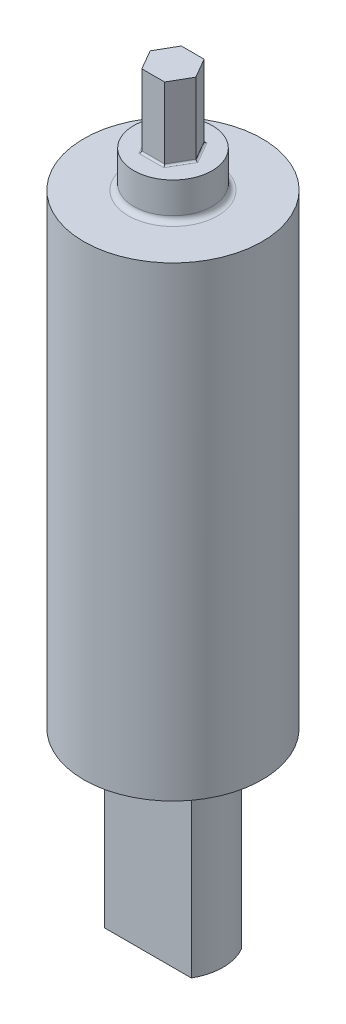
ISO-10303-21;
HEADER;
FILE_DESCRIPTION(('STEP AP214'),'2;1');
FILE_NAME('part.step','',(''),(''),'','','');
FILE_SCHEMA(('AUTOMOTIVE_DESIGN { 1 0 10303 214 1 1 1 1 }'));
ENDSEC;
DATA;
#1=APPLICATION_CONTEXT('core data for automotive mechanical design processes');
#2=APPLICATION_PROTOCOL_DEFINITION('international standard','automotive_design',2000,#1);
#3=PRODUCT_CONTEXT('',#1,'mechanical');
#4=PRODUCT('Part','Part','',(#3));
#5=PRODUCT_RELATED_PRODUCT_CATEGORY('part','',(#4));
#6=PRODUCT_DEFINITION_FORMATION('','',#4);
#7=PRODUCT_DEFINITION_CONTEXT('part definition',#1,'design');
#8=PRODUCT_DEFINITION('design','',#6,#7);
#9=PRODUCT_DEFINITION_SHAPE('','',#8);
#10=(LENGTH_UNIT() NAMED_UNIT(*) SI_UNIT(.MILLI.,.METRE.));
#11=(NAMED_UNIT(*) PLANE_ANGLE_UNIT() SI_UNIT($,.RADIAN.));
#12=(NAMED_UNIT(*) SI_UNIT($,.STERADIAN.) SOLID_ANGLE_UNIT());
#13=UNCERTAINTY_MEASURE_WITH_UNIT(LENGTH_MEASURE(1.E-05),#10,'distance_accuracy_value','');
#14=(GEOMETRIC_REPRESENTATION_CONTEXT(3) GLOBAL_UNCERTAINTY_ASSIGNED_CONTEXT((#13)) GLOBAL_UNIT_ASSIGNED_CONTEXT((#10,
#11,#12)) REPRESENTATION_CONTEXT('',''));
#15=CARTESIAN_POINT('',(0.,0.,0.));
#16=DIRECTION('',(0.,0.,1.));
#17=DIRECTION('',(1.,0.,0.));
#18=AXIS2_PLACEMENT_3D('',#15,#16,#17);
#19=CARTESIAN_POINT('',(0.,-35.6,0.));
#20=DIRECTION('',(0.,1.,0.));
#21=DIRECTION('',(0.,0.,1.));
#22=AXIS2_PLACEMENT_3D('',#19,#20,#21);
#23=CYLINDRICAL_SURFACE('',#22,4.9);
#24=CARTESIAN_POINT('',(0.,0.,0.));
#25=DIRECTION('',(0.,1.,0.));
#26=DIRECTION('',(0.,0.,1.));
#27=AXIS2_PLACEMENT_3D('',#24,#25,#26);
#28=CIRCLE('',#27,4.9);
#29=CARTESIAN_POINT('',(0.,0.,4.9));
#30=VERTEX_POINT('',#29);
#31=EDGE_CURVE('E220',#30,#30,#28,.T.);
#32=ORIENTED_EDGE('',*,*,#31,.F.);
#33=EDGE_LOOP('',(#32));
#34=FACE_BOUND('',#33,.T.);
#35=CARTESIAN_POINT('',(0.,-25.6,0.));
#36=DIRECTION('',(0.,-1.,0.));
#37=DIRECTION('',(0.,0.,-1.));
#38=AXIS2_PLACEMENT_3D('',#35,#36,#37);
#39=CIRCLE('',#38,4.9);
#40=CARTESIAN_POINT('',(0.,-25.6,-4.9));
#41=VERTEX_POINT('',#40);
#42=EDGE_CURVE('E172',#41,#41,#39,.T.);
#43=ORIENTED_EDGE('',*,*,#42,.F.);
#44=EDGE_LOOP('',(#43));
#45=FACE_BOUND('',#44,.T.);
#46=ADVANCED_FACE('F39',(#34,#45),#23,.T.);
#47=CARTESIAN_POINT('',(0.,0.,0.));
#48=DIRECTION('',(0.,1.,0.));
#49=DIRECTION('',(0.,0.,1.));
#50=AXIS2_PLACEMENT_3D('',#47,#48,#49);
#51=PLANE('',#50);
#52=CARTESIAN_POINT('',(0.,0.,0.));
#53=DIRECTION('',(0.,1.,0.));
#54=DIRECTION('',(0.,0.,1.));
#55=AXIS2_PLACEMENT_3D('',#52,#53,#54);
#56=CIRCLE('',#55,2.45);
#57=CARTESIAN_POINT('',(0.,0.,2.45));
#58=VERTEX_POINT('',#57);
#59=EDGE_CURVE('E263',#58,#58,#56,.F.);
#60=ORIENTED_EDGE('',*,*,#59,.T.);
#61=EDGE_LOOP('',(#60));
#62=FACE_BOUND('',#61,.T.);
#63=ORIENTED_EDGE('',*,*,#31,.T.);
#64=EDGE_LOOP('',(#63));
#65=FACE_BOUND('',#64,.T.);
#66=ADVANCED_FACE('F314',(#62,#65),#51,.T.);
#67=CARTESIAN_POINT('',(0.,2.,0.));
#68=DIRECTION('',(0.,-1.,0.));
#69=DIRECTION('',(0.,0.,-1.));
#70=AXIS2_PLACEMENT_3D('',#67,#68,#69);
#71=CYLINDRICAL_SURFACE('',#70,2.15);
#72=CARTESIAN_POINT('',(0.,0.3,0.));
#73=DIRECTION('',(0.,1.,0.));
#74=DIRECTION('',(0.,0.,1.));
#75=AXIS2_PLACEMENT_3D('',#72,#73,#74);
#76=CIRCLE('',#75,2.15);
#77=CARTESIAN_POINT('',(0.,0.3,2.15));
#78=VERTEX_POINT('',#77);
#79=EDGE_CURVE('E250',#78,#78,#76,.T.);
#80=ORIENTED_EDGE('',*,*,#79,.T.);
#81=EDGE_LOOP('',(#80));
#82=FACE_BOUND('',#81,.T.);
#83=CARTESIAN_POINT('',(0.,2.,0.));
#84=DIRECTION('',(0.,1.,0.));
#85=DIRECTION('',(0.,0.,1.));
#86=AXIS2_PLACEMENT_3D('',#83,#84,#85);
#87=CIRCLE('',#86,2.15);
#88=CARTESIAN_POINT('',(0.,2.,2.15));
#89=VERTEX_POINT('',#88);
#90=EDGE_CURVE('E211',#89,#89,#87,.T.);
#91=ORIENTED_EDGE('',*,*,#90,.F.);
#92=EDGE_LOOP('',(#91));
#93=FACE_BOUND('',#92,.T.);
#94=ADVANCED_FACE('F322',(#82,#93),#71,.T.);
#95=CARTESIAN_POINT('',(0.,2.,0.));
#96=DIRECTION('',(0.,1.,0.));
#97=DIRECTION('',(0.,0.,1.));
#98=AXIS2_PLACEMENT_3D('',#95,#96,#97);
#99=PLANE('',#98);
#100=DIRECTION('',(0.5,0.,0.866025403784439));
#101=VECTOR('',#100,1.);
#102=CARTESIAN_POINT('',(-1.02624010348456,2.,0.592500000000001));
#103=LINE('',#102,#101);
#104=CARTESIAN_POINT('',(-0.684160068989707,2.,1.185));
#105=VERTEX_POINT('',#104);
#106=CARTESIAN_POINT('',(-1.36832013797941,2.,0.));
#107=VERTEX_POINT('',#106);
#108=EDGE_CURVE('E225',#105,#107,#103,.F.);
#109=ORIENTED_EDGE('',*,*,#108,.T.);
#110=DIRECTION('',(-0.5,0.,0.866025403784439));
#111=VECTOR('',#110,1.);
#112=CARTESIAN_POINT('',(-1.02624010348456,2.,-0.5925));
#113=LINE('',#112,#111);
#114=CARTESIAN_POINT('',(-0.684160068989707,2.,-1.185));
#115=VERTEX_POINT('',#114);
#116=EDGE_CURVE('E234',#107,#115,#113,.F.);
#117=ORIENTED_EDGE('',*,*,#116,.T.);
#118=DIRECTION('',(-1.,0.,0.));
#119=VECTOR('',#118,1.);
#120=CARTESIAN_POINT('',(0.,2.,-1.185));
#121=LINE('',#120,#119);
#122=CARTESIAN_POINT('',(0.684160068989706,2.,-1.185));
#123=VERTEX_POINT('',#122);
#124=EDGE_CURVE('E235',#115,#123,#121,.F.);
#125=ORIENTED_EDGE('',*,*,#124,.T.);
#126=DIRECTION('',(-0.5,0.,-0.866025403784438));
#127=VECTOR('',#126,1.);
#128=CARTESIAN_POINT('',(1.02624010348456,2.,-0.5925));
#129=LINE('',#128,#127);
#130=CARTESIAN_POINT('',(1.36832013797941,2.,0.));
#131=VERTEX_POINT('',#130);
#132=EDGE_CURVE('E229',#123,#131,#129,.F.);
#133=ORIENTED_EDGE('',*,*,#132,.T.);
#134=DIRECTION('',(0.5,0.,-0.866025403784439));
#135=VECTOR('',#134,1.);
#136=CARTESIAN_POINT('',(1.02624010348456,2.,0.5925));
#137=LINE('',#136,#135);
#138=CARTESIAN_POINT('',(0.684160068989706,2.,1.185));
#139=VERTEX_POINT('',#138);
#140=EDGE_CURVE('E226',#131,#139,#137,.F.);
#141=ORIENTED_EDGE('',*,*,#140,.T.);
#142=DIRECTION('',(1.,0.,0.));
#143=VECTOR('',#142,1.);
#144=CARTESIAN_POINT('',(0.,2.,1.185));
#145=LINE('',#144,#143);
#146=EDGE_CURVE('E228',#139,#105,#145,.F.);
#147=ORIENTED_EDGE('',*,*,#146,.T.);
#148=EDGE_LOOP('',(#109,#117,#125,#133,#141,#147));
#149=FACE_BOUND('',#148,.T.);
#150=ORIENTED_EDGE('',*,*,#90,.T.);
#151=EDGE_LOOP('',(#150));
#152=FACE_BOUND('',#151,.T.);
#153=ADVANCED_FACE('F367',(#149,#152),#99,.T.);
#154=CARTESIAN_POINT('',(0.626425042070744,6.,1.085));
#155=DIRECTION('',(-0.866025403784439,0.,-0.5));
#156=DIRECTION('',(-0.5,0.,0.866025403784439));
#157=AXIS2_PLACEMENT_3D('',#154,#155,#156);
#158=PLANE('',#157);
#159=DIRECTION('',(0.,-1.,0.));
#160=VECTOR('',#159,1.);
#161=CARTESIAN_POINT('',(0.626425042070744,6.,1.085));
#162=LINE('',#161,#160);
#163=CARTESIAN_POINT('',(0.626425042070744,6.,1.085));
#164=VERTEX_POINT('',#163);
#165=CARTESIAN_POINT('',(0.626425042070744,2.1,1.085));
#166=VERTEX_POINT('',#165);
#167=EDGE_CURVE('E196',#164,#166,#162,.T.);
#168=ORIENTED_EDGE('',*,*,#167,.T.);
#169=DIRECTION('',(0.5,0.,-0.866025403784439));
#170=VECTOR('',#169,1.);
#171=CARTESIAN_POINT('',(0.626425042070744,2.1,1.085));
#172=LINE('',#171,#170);
#173=CARTESIAN_POINT('',(1.25285008414149,2.1,0.));
#174=VERTEX_POINT('',#173);
#175=EDGE_CURVE('E241',#166,#174,#172,.T.);
#176=ORIENTED_EDGE('',*,*,#175,.T.);
#177=DIRECTION('',(0.,-1.,0.));
#178=VECTOR('',#177,1.);
#179=CARTESIAN_POINT('',(1.25285008414149,6.,0.));
#180=LINE('',#179,#178);
#181=CARTESIAN_POINT('',(1.25285008414149,6.,0.));
#182=VERTEX_POINT('',#181);
#183=EDGE_CURVE('E214',#182,#174,#180,.T.);
#184=ORIENTED_EDGE('',*,*,#183,.F.);
#185=DIRECTION('',(0.5,0.,-0.866025403784439));
#186=VECTOR('',#185,1.);
#187=CARTESIAN_POINT('',(0.626425042070744,6.,1.085));
#188=LINE('',#187,#186);
#189=EDGE_CURVE('E182',#164,#182,#188,.T.);
#190=ORIENTED_EDGE('',*,*,#189,.F.);
#191=EDGE_LOOP('',(#168,#176,#184,#190));
#192=FACE_BOUND('',#191,.T.);
#193=ADVANCED_FACE('F372',(#192),#158,.F.);
#194=CARTESIAN_POINT('',(1.25285008414149,6.,0.));
#195=DIRECTION('',(-0.866025403784439,0.,0.5));
#196=DIRECTION('',(0.5,0.,0.866025403784438));
#197=AXIS2_PLACEMENT_3D('',#194,#195,#196);
#198=PLANE('',#197);
#199=ORIENTED_EDGE('',*,*,#183,.T.);
#200=DIRECTION('',(-0.5,0.,-0.866025403784438));
#201=VECTOR('',#200,1.);
#202=CARTESIAN_POINT('',(1.25285008414149,2.1,0.));
#203=LINE('',#202,#201);
#204=CARTESIAN_POINT('',(0.626425042070743,2.1,-1.085));
#205=VERTEX_POINT('',#204);
#206=EDGE_CURVE('E237',#174,#205,#203,.T.);
#207=ORIENTED_EDGE('',*,*,#206,.T.);
#208=DIRECTION('',(0.,-1.,0.));
#209=VECTOR('',#208,1.);
#210=CARTESIAN_POINT('',(0.626425042070743,6.,-1.085));
#211=LINE('',#210,#209);
#212=CARTESIAN_POINT('',(0.626425042070743,6.,-1.085));
#213=VERTEX_POINT('',#212);
#214=EDGE_CURVE('E209',#213,#205,#211,.T.);
#215=ORIENTED_EDGE('',*,*,#214,.F.);
#216=DIRECTION('',(-0.5,0.,-0.866025403784438));
#217=VECTOR('',#216,1.);
#218=CARTESIAN_POINT('',(1.25285008414149,6.,0.));
#219=LINE('',#218,#217);
#220=EDGE_CURVE('E187',#182,#213,#219,.T.);
#221=ORIENTED_EDGE('',*,*,#220,.F.);
#222=EDGE_LOOP('',(#199,#207,#215,#221));
#223=FACE_BOUND('',#222,.T.);
#224=ADVANCED_FACE('F382',(#223),#198,.F.);
#225=CARTESIAN_POINT('',(0.626425042070743,6.,-1.085));
#226=DIRECTION('',(0.,0.,1.));
#227=DIRECTION('',(1.,0.,0.));
#228=AXIS2_PLACEMENT_3D('',#225,#226,#227);
#229=PLANE('',#228);
#230=ORIENTED_EDGE('',*,*,#214,.T.);
#231=DIRECTION('',(-1.,0.,0.));
#232=VECTOR('',#231,1.);
#233=CARTESIAN_POINT('',(0.626425042070743,2.1,-1.085));
#234=LINE('',#233,#232);
#235=CARTESIAN_POINT('',(-0.626425042070744,2.1,-1.085));
#236=VERTEX_POINT('',#235);
#237=EDGE_CURVE('E240',#205,#236,#234,.T.);
#238=ORIENTED_EDGE('',*,*,#237,.T.);
#239=DIRECTION('',(0.,-1.,0.));
#240=VECTOR('',#239,1.);
#241=CARTESIAN_POINT('',(-0.626425042070744,6.,-1.085));
#242=LINE('',#241,#240);
#243=CARTESIAN_POINT('',(-0.626425042070744,6.,-1.085));
#244=VERTEX_POINT('',#243);
#245=EDGE_CURVE('E207',#244,#236,#242,.T.);
#246=ORIENTED_EDGE('',*,*,#245,.F.);
#247=DIRECTION('',(-1.,0.,0.));
#248=VECTOR('',#247,1.);
#249=CARTESIAN_POINT('',(0.626425042070743,6.,-1.085));
#250=LINE('',#249,#248);
#251=EDGE_CURVE('E186',#213,#244,#250,.T.);
#252=ORIENTED_EDGE('',*,*,#251,.F.);
#253=EDGE_LOOP('',(#230,#238,#246,#252));
#254=FACE_BOUND('',#253,.T.);
#255=ADVANCED_FACE('F413',(#254),#229,.F.);
#256=CARTESIAN_POINT('',(-0.626425042070744,6.,-1.085));
#257=DIRECTION('',(0.866025403784439,0.,0.5));
#258=DIRECTION('',(0.5,0.,-0.866025403784439));
#259=AXIS2_PLACEMENT_3D('',#256,#257,#258);
#260=PLANE('',#259);
#261=ORIENTED_EDGE('',*,*,#245,.T.);
#262=DIRECTION('',(-0.5,0.,0.866025403784439));
#263=VECTOR('',#262,1.);
#264=CARTESIAN_POINT('',(-0.626425042070744,2.1,-1.085));
#265=LINE('',#264,#263);
#266=CARTESIAN_POINT('',(-1.25285008414149,2.1,0.));
#267=VERTEX_POINT('',#266);
#268=EDGE_CURVE('E223',#236,#267,#265,.T.);
#269=ORIENTED_EDGE('',*,*,#268,.T.);
#270=DIRECTION('',(0.,-1.,0.));
#271=VECTOR('',#270,1.);
#272=CARTESIAN_POINT('',(-1.25285008414149,6.,0.));
#273=LINE('',#272,#271);
#274=CARTESIAN_POINT('',(-1.25285008414149,6.,0.));
#275=VERTEX_POINT('',#274);
#276=EDGE_CURVE('E202',#275,#267,#273,.T.);
#277=ORIENTED_EDGE('',*,*,#276,.F.);
#278=DIRECTION('',(-0.5,0.,0.866025403784439));
#279=VECTOR('',#278,1.);
#280=CARTESIAN_POINT('',(-0.626425042070744,6.,-1.085));
#281=LINE('',#280,#279);
#282=EDGE_CURVE('E193',#244,#275,#281,.T.);
#283=ORIENTED_EDGE('',*,*,#282,.F.);
#284=EDGE_LOOP('',(#261,#269,#277,#283));
#285=FACE_BOUND('',#284,.T.);
#286=ADVANCED_FACE('F406',(#285),#260,.F.);
#287=CARTESIAN_POINT('',(-1.25285008414149,6.,0.));
#288=DIRECTION('',(0.866025403784439,0.,-0.5));
#289=DIRECTION('',(-0.5,0.,-0.866025403784439));
#290=AXIS2_PLACEMENT_3D('',#287,#288,#289);
#291=PLANE('',#290);
#292=ORIENTED_EDGE('',*,*,#276,.T.);
#293=DIRECTION('',(0.5,0.,0.866025403784439));
#294=VECTOR('',#293,1.);
#295=CARTESIAN_POINT('',(-1.25285008414149,2.1,0.));
#296=LINE('',#295,#294);
#297=CARTESIAN_POINT('',(-0.626425042070745,2.1,1.085));
#298=VERTEX_POINT('',#297);
#299=EDGE_CURVE('E244',#267,#298,#296,.T.);
#300=ORIENTED_EDGE('',*,*,#299,.T.);
#301=DIRECTION('',(0.,-1.,0.));
#302=VECTOR('',#301,1.);
#303=CARTESIAN_POINT('',(-0.626425042070745,6.,1.085));
#304=LINE('',#303,#302);
#305=CARTESIAN_POINT('',(-0.626425042070745,6.,1.085));
#306=VERTEX_POINT('',#305);
#307=EDGE_CURVE('E197',#306,#298,#304,.T.);
#308=ORIENTED_EDGE('',*,*,#307,.F.);
#309=DIRECTION('',(0.5,0.,0.866025403784439));
#310=VECTOR('',#309,1.);
#311=CARTESIAN_POINT('',(-1.25285008414149,6.,0.));
#312=LINE('',#311,#310);
#313=EDGE_CURVE('E192',#275,#306,#312,.T.);
#314=ORIENTED_EDGE('',*,*,#313,.F.);
#315=EDGE_LOOP('',(#292,#300,#308,#314));
#316=FACE_BOUND('',#315,.T.);
#317=ADVANCED_FACE('F408',(#316),#291,.F.);
#318=CARTESIAN_POINT('',(-0.626425042070745,6.,1.085));
#319=DIRECTION('',(0.,0.,-1.));
#320=DIRECTION('',(-1.,0.,0.));
#321=AXIS2_PLACEMENT_3D('',#318,#319,#320);
#322=PLANE('',#321);
#323=ORIENTED_EDGE('',*,*,#307,.T.);
#324=DIRECTION('',(1.,0.,0.));
#325=VECTOR('',#324,1.);
#326=CARTESIAN_POINT('',(-0.626425042070745,2.1,1.085));
#327=LINE('',#326,#325);
#328=EDGE_CURVE('E243',#298,#166,#327,.T.);
#329=ORIENTED_EDGE('',*,*,#328,.T.);
#330=ORIENTED_EDGE('',*,*,#167,.F.);
#331=DIRECTION('',(1.,0.,0.));
#332=VECTOR('',#331,1.);
#333=CARTESIAN_POINT('',(-0.626425042070745,6.,1.085));
#334=LINE('',#333,#332);
#335=EDGE_CURVE('E191',#306,#164,#334,.T.);
#336=ORIENTED_EDGE('',*,*,#335,.F.);
#337=EDGE_LOOP('',(#323,#329,#330,#336));
#338=FACE_BOUND('',#337,.T.);
#339=ADVANCED_FACE('F405',(#338),#322,.F.);
#340=CARTESIAN_POINT('',(0.,6.,0.));
#341=DIRECTION('',(0.,1.,0.));
#342=DIRECTION('',(0.,0.,1.));
#343=AXIS2_PLACEMENT_3D('',#340,#341,#342);
#344=PLANE('',#343);
#345=ORIENTED_EDGE('',*,*,#189,.T.);
#346=ORIENTED_EDGE('',*,*,#220,.T.);
#347=ORIENTED_EDGE('',*,*,#251,.T.);
#348=ORIENTED_EDGE('',*,*,#282,.T.);
#349=ORIENTED_EDGE('',*,*,#313,.T.);
#350=ORIENTED_EDGE('',*,*,#335,.T.);
#351=EDGE_LOOP('',(#345,#346,#347,#348,#349,#350));
#352=FACE_BOUND('',#351,.T.);
#353=ADVANCED_FACE('F352',(#352),#344,.T.);
#354=CARTESIAN_POINT('',(0.713027582449188,2.1,1.135));
#355=DIRECTION('',(0.5,0.,-0.866025403784439));
#356=DIRECTION('',(-0.866025403784439,0.,-0.5));
#357=AXIS2_PLACEMENT_3D('',#354,#355,#356);
#358=CYLINDRICAL_SURFACE('',#357,0.1);
#359=CARTESIAN_POINT('',(0.684160068989707,2.1,1.185));
#360=DIRECTION('',(0.866025403784438,0.,-0.5));
#361=DIRECTION('',(0.5,0.,0.866025403784439));
#362=AXIS2_PLACEMENT_3D('',#359,#360,#361);
#363=ELLIPSE('',#362,0.115470053837925,0.1);
#364=EDGE_CURVE('E259',#139,#166,#363,.T.);
#365=ORIENTED_EDGE('',*,*,#364,.F.);
#366=ORIENTED_EDGE('',*,*,#140,.F.);
#367=CARTESIAN_POINT('',(1.36832013797941,2.1,0.));
#368=DIRECTION('',(0.,0.,-1.));
#369=DIRECTION('',(1.,0.,0.));
#370=AXIS2_PLACEMENT_3D('',#367,#368,#369);
#371=ELLIPSE('',#370,0.115470053837925,0.1);
#372=EDGE_CURVE('E190',#174,#131,#371,.F.);
#373=ORIENTED_EDGE('',*,*,#372,.F.);
#374=ORIENTED_EDGE('',*,*,#175,.F.);
#375=EDGE_LOOP('',(#365,#366,#373,#374));
#376=FACE_BOUND('',#375,.T.);
#377=ADVANCED_FACE('F347',(#376),#358,.F.);
#378=CARTESIAN_POINT('',(1.33945262451993,2.1,-0.0500000000000002));
#379=DIRECTION('',(-0.5,0.,-0.866025403784438));
#380=DIRECTION('',(-0.866025403784439,0.,0.5));
#381=AXIS2_PLACEMENT_3D('',#378,#379,#380);
#382=CYLINDRICAL_SURFACE('',#381,0.1);
#383=ORIENTED_EDGE('',*,*,#372,.T.);
#384=ORIENTED_EDGE('',*,*,#132,.F.);
#385=CARTESIAN_POINT('',(0.684160068989705,2.1,-1.185));
#386=DIRECTION('',(-0.866025403784439,0.,-0.5));
#387=DIRECTION('',(0.5,0.,-0.866025403784439));
#388=AXIS2_PLACEMENT_3D('',#385,#386,#387);
#389=ELLIPSE('',#388,0.115470053837925,0.1);
#390=EDGE_CURVE('E251',#205,#123,#389,.F.);
#391=ORIENTED_EDGE('',*,*,#390,.F.);
#392=ORIENTED_EDGE('',*,*,#206,.F.);
#393=EDGE_LOOP('',(#383,#384,#391,#392));
#394=FACE_BOUND('',#393,.T.);
#395=ADVANCED_FACE('F349',(#394),#382,.F.);
#396=CARTESIAN_POINT('',(-0.626425042070745,2.1,1.185));
#397=DIRECTION('',(1.,0.,0.));
#398=DIRECTION('',(0.,0.,-1.));
#399=AXIS2_PLACEMENT_3D('',#396,#397,#398);
#400=CYLINDRICAL_SURFACE('',#399,0.1);
#401=ORIENTED_EDGE('',*,*,#364,.T.);
#402=ORIENTED_EDGE('',*,*,#328,.F.);
#403=CARTESIAN_POINT('',(-0.684160068989707,2.1,1.185));
#404=DIRECTION('',(0.866025403784439,0.,0.5));
#405=DIRECTION('',(-0.5,0.,0.866025403784439));
#406=AXIS2_PLACEMENT_3D('',#403,#404,#405);
#407=ELLIPSE('',#406,0.115470053837925,0.1);
#408=EDGE_CURVE('E252',#105,#298,#407,.T.);
#409=ORIENTED_EDGE('',*,*,#408,.F.);
#410=ORIENTED_EDGE('',*,*,#146,.F.);
#411=EDGE_LOOP('',(#401,#402,#409,#410));
#412=FACE_BOUND('',#411,.T.);
#413=ADVANCED_FACE('F344',(#412),#400,.F.);
#414=CARTESIAN_POINT('',(0.626425042070743,2.1,-1.185));
#415=DIRECTION('',(-1.,0.,0.));
#416=DIRECTION('',(0.,0.,1.));
#417=AXIS2_PLACEMENT_3D('',#414,#415,#416);
#418=CYLINDRICAL_SURFACE('',#417,0.1);
#419=ORIENTED_EDGE('',*,*,#390,.T.);
#420=ORIENTED_EDGE('',*,*,#124,.F.);
#421=CARTESIAN_POINT('',(-0.684160068989707,2.1,-1.185));
#422=DIRECTION('',(-0.866025403784439,0.,0.5));
#423=DIRECTION('',(-0.5,0.,-0.866025403784439));
#424=AXIS2_PLACEMENT_3D('',#421,#422,#423);
#425=ELLIPSE('',#424,0.115470053837925,0.1);
#426=EDGE_CURVE('E248',#236,#115,#425,.F.);
#427=ORIENTED_EDGE('',*,*,#426,.F.);
#428=ORIENTED_EDGE('',*,*,#237,.F.);
#429=EDGE_LOOP('',(#419,#420,#427,#428));
#430=FACE_BOUND('',#429,.T.);
#431=ADVANCED_FACE('F336',(#430),#418,.F.);
#432=CARTESIAN_POINT('',(-1.33945262451993,2.1,0.0500000000000004));
#433=DIRECTION('',(0.5,0.,0.866025403784439));
#434=DIRECTION('',(0.866025403784439,0.,-0.5));
#435=AXIS2_PLACEMENT_3D('',#432,#433,#434);
#436=CYLINDRICAL_SURFACE('',#435,0.1);
#437=ORIENTED_EDGE('',*,*,#408,.T.);
#438=ORIENTED_EDGE('',*,*,#299,.F.);
#439=CARTESIAN_POINT('',(-1.36832013797941,2.1,0.));
#440=DIRECTION('',(0.,0.,1.));
#441=DIRECTION('',(1.,0.,0.));
#442=AXIS2_PLACEMENT_3D('',#439,#440,#441);
#443=ELLIPSE('',#442,0.115470053837925,0.1);
#444=EDGE_CURVE('E179',#107,#267,#443,.T.);
#445=ORIENTED_EDGE('',*,*,#444,.F.);
#446=ORIENTED_EDGE('',*,*,#108,.F.);
#447=EDGE_LOOP('',(#437,#438,#445,#446));
#448=FACE_BOUND('',#447,.T.);
#449=ADVANCED_FACE('F335',(#448),#436,.F.);
#450=CARTESIAN_POINT('',(-0.713027582449188,2.1,-1.135));
#451=DIRECTION('',(-0.5,0.,0.866025403784439));
#452=DIRECTION('',(0.866025403784439,0.,0.5));
#453=AXIS2_PLACEMENT_3D('',#450,#451,#452);
#454=CYLINDRICAL_SURFACE('',#453,0.1);
#455=ORIENTED_EDGE('',*,*,#426,.T.);
#456=ORIENTED_EDGE('',*,*,#116,.F.);
#457=ORIENTED_EDGE('',*,*,#444,.T.);
#458=ORIENTED_EDGE('',*,*,#268,.F.);
#459=EDGE_LOOP('',(#455,#456,#457,#458));
#460=FACE_BOUND('',#459,.T.);
#461=ADVANCED_FACE('F327',(#460),#454,.F.);
#462=CARTESIAN_POINT('',(0.,0.3,0.));
#463=DIRECTION('',(0.,1.,0.));
#464=DIRECTION('',(0.,0.,1.));
#465=AXIS2_PLACEMENT_3D('',#462,#463,#464);
#466=TOROIDAL_SURFACE('',#465,2.45,0.3);
#467=ORIENTED_EDGE('',*,*,#59,.F.);
#468=EDGE_LOOP('',(#467));
#469=FACE_BOUND('',#468,.T.);
#470=ORIENTED_EDGE('',*,*,#79,.F.);
#471=EDGE_LOOP('',(#470));
#472=FACE_BOUND('',#471,.T.);
#473=ADVANCED_FACE('F332',(#469,#472),#466,.F.);
#474=CARTESIAN_POINT('',(0.,-25.6,0.));
#475=DIRECTION('',(0.,-1.,0.));
#476=DIRECTION('',(0.,0.,-1.));
#477=AXIS2_PLACEMENT_3D('',#474,#475,#476);
#478=CYLINDRICAL_SURFACE('',#477,2.75);
#479=DIRECTION('',(0.,-1.,0.));
#480=VECTOR('',#479,1.);
#481=CARTESIAN_POINT('',(-2.38156986040721,-25.6,1.375));
#482=LINE('',#481,#480);
#483=CARTESIAN_POINT('',(-2.38156986040721,-25.9,1.375));
#484=VERTEX_POINT('',#483);
#485=CARTESIAN_POINT('',(-2.38156986040721,-35.6,1.375));
#486=VERTEX_POINT('',#485);
#487=EDGE_CURVE('E160',#484,#486,#482,.T.);
#488=ORIENTED_EDGE('',*,*,#487,.F.);
#489=CARTESIAN_POINT('',(0.,-25.9,0.));
#490=DIRECTION('',(0.,-1.,0.));
#491=DIRECTION('',(0.,0.,-1.));
#492=AXIS2_PLACEMENT_3D('',#489,#490,#491);
#493=CIRCLE('',#492,2.75);
#494=CARTESIAN_POINT('',(-2.3815698604072,-25.9,-1.375));
#495=VERTEX_POINT('',#494);
#496=EDGE_CURVE('E269',#484,#495,#493,.T.);
#497=ORIENTED_EDGE('',*,*,#496,.T.);
#498=DIRECTION('',(0.,-1.,0.));
#499=VECTOR('',#498,1.);
#500=CARTESIAN_POINT('',(-2.3815698604072,-25.6,-1.375));
#501=LINE('',#500,#499);
#502=CARTESIAN_POINT('',(-2.3815698604072,-35.6,-1.375));
#503=VERTEX_POINT('',#502);
#504=EDGE_CURVE('E178',#495,#503,#501,.T.);
#505=ORIENTED_EDGE('',*,*,#504,.T.);
#506=CARTESIAN_POINT('',(0.,-35.6,0.));
#507=DIRECTION('',(0.,-1.,0.));
#508=DIRECTION('',(0.,0.,-1.));
#509=AXIS2_PLACEMENT_3D('',#506,#507,#508);
#510=CIRCLE('',#509,2.75);
#511=EDGE_CURVE('E166',#486,#503,#510,.T.);
#512=ORIENTED_EDGE('',*,*,#511,.F.);
#513=EDGE_LOOP('',(#488,#497,#505,#512));
#514=FACE_BOUND('',#513,.T.);
#515=ADVANCED_FACE('F351',(#514),#478,.T.);
#516=CARTESIAN_POINT('',(0.,-25.6,-1.375));
#517=DIRECTION('',(0.,0.,-1.));
#518=DIRECTION('',(-1.,0.,0.));
#519=AXIS2_PLACEMENT_3D('',#516,#517,#518);
#520=PLANE('',#519);
#521=ORIENTED_EDGE('',*,*,#504,.F.);
#522=DIRECTION('',(1.,0.,0.));
#523=VECTOR('',#522,1.);
#524=CARTESIAN_POINT('',(2.38156986040721,-25.9,-1.375));
#525=LINE('',#524,#523);
#526=CARTESIAN_POINT('',(2.38156986040721,-25.9,-1.375));
#527=VERTEX_POINT('',#526);
#528=EDGE_CURVE('E70',#495,#527,#525,.T.);
#529=ORIENTED_EDGE('',*,*,#528,.T.);
#530=DIRECTION('',(0.,-1.,0.));
#531=VECTOR('',#530,1.);
#532=CARTESIAN_POINT('',(2.38156986040721,-25.6,-1.375));
#533=LINE('',#532,#531);
#534=CARTESIAN_POINT('',(2.38156986040721,-35.6,-1.375));
#535=VERTEX_POINT('',#534);
#536=EDGE_CURVE('E157',#527,#535,#533,.T.);
#537=ORIENTED_EDGE('',*,*,#536,.T.);
#538=DIRECTION('',(1.,0.,0.));
#539=VECTOR('',#538,1.);
#540=CARTESIAN_POINT('',(0.,-35.6,-1.375));
#541=LINE('',#540,#539);
#542=EDGE_CURVE('E175',#503,#535,#541,.T.);
#543=ORIENTED_EDGE('',*,*,#542,.F.);
#544=EDGE_LOOP('',(#521,#529,#537,#543));
#545=FACE_BOUND('',#544,.T.);
#546=ADVANCED_FACE('F363',(#545),#520,.T.);
#547=CARTESIAN_POINT('',(0.,-25.6,0.));
#548=DIRECTION('',(0.,-1.,0.));
#549=DIRECTION('',(0.,0.,-1.));
#550=AXIS2_PLACEMENT_3D('',#547,#548,#549);
#551=CYLINDRICAL_SURFACE('',#550,2.75);
#552=ORIENTED_EDGE('',*,*,#536,.F.);
#553=CARTESIAN_POINT('',(0.,-25.9,0.));
#554=DIRECTION('',(0.,-1.,0.));
#555=DIRECTION('',(0.,0.,-1.));
#556=AXIS2_PLACEMENT_3D('',#553,#554,#555);
#557=CIRCLE('',#556,2.75);
#558=CARTESIAN_POINT('',(2.38156986040721,-25.9,1.375));
#559=VERTEX_POINT('',#558);
#560=EDGE_CURVE('E52',#527,#559,#557,.T.);
#561=ORIENTED_EDGE('',*,*,#560,.T.);
#562=DIRECTION('',(0.,-1.,0.));
#563=VECTOR('',#562,1.);
#564=CARTESIAN_POINT('',(2.38156986040721,-25.6,1.375));
#565=LINE('',#564,#563);
#566=CARTESIAN_POINT('',(2.38156986040721,-35.6,1.375));
#567=VERTEX_POINT('',#566);
#568=EDGE_CURVE('E146',#559,#567,#565,.T.);
#569=ORIENTED_EDGE('',*,*,#568,.T.);
#570=CARTESIAN_POINT('',(0.,-35.6,0.));
#571=DIRECTION('',(0.,-1.,0.));
#572=DIRECTION('',(0.,0.,-1.));
#573=AXIS2_PLACEMENT_3D('',#570,#571,#572);
#574=CIRCLE('',#573,2.75);
#575=EDGE_CURVE('E153',#535,#567,#574,.T.);
#576=ORIENTED_EDGE('',*,*,#575,.F.);
#577=EDGE_LOOP('',(#552,#561,#569,#576));
#578=FACE_BOUND('',#577,.T.);
#579=ADVANCED_FACE('F151',(#578),#551,.T.);
#580=CARTESIAN_POINT('',(0.,-25.6,1.375));
#581=DIRECTION('',(0.,0.,-1.));
#582=DIRECTION('',(-1.,0.,0.));
#583=AXIS2_PLACEMENT_3D('',#580,#581,#582);
#584=PLANE('',#583);
#585=ORIENTED_EDGE('',*,*,#568,.F.);
#586=DIRECTION('',(1.,0.,0.));
#587=VECTOR('',#586,1.);
#588=CARTESIAN_POINT('',(0.,-25.9,1.375));
#589=LINE('',#588,#587);
#590=EDGE_CURVE('E11',#559,#484,#589,.F.);
#591=ORIENTED_EDGE('',*,*,#590,.T.);
#592=ORIENTED_EDGE('',*,*,#487,.T.);
#593=DIRECTION('',(1.,0.,0.));
#594=VECTOR('',#593,1.);
#595=CARTESIAN_POINT('',(0.,-35.6,1.375));
#596=LINE('',#595,#594);
#597=EDGE_CURVE('E162',#486,#567,#596,.T.);
#598=ORIENTED_EDGE('',*,*,#597,.T.);
#599=EDGE_LOOP('',(#585,#591,#592,#598));
#600=FACE_BOUND('',#599,.T.);
#601=ADVANCED_FACE('F161',(#600),#584,.F.);
#602=CARTESIAN_POINT('',(0.,-25.6,0.));
#603=DIRECTION('',(0.,-1.,0.));
#604=DIRECTION('',(0.,0.,-1.));
#605=AXIS2_PLACEMENT_3D('',#602,#603,#604);
#606=PLANE('',#605);
#607=DIRECTION('',(1.,0.,0.));
#608=VECTOR('',#607,1.);
#609=CARTESIAN_POINT('',(-2.3815698604072,-25.6,-1.675));
#610=LINE('',#609,#608);
#611=CARTESIAN_POINT('',(2.54889682019504,-25.6,-1.67499999999989));
#612=VERTEX_POINT('',#611);
#613=CARTESIAN_POINT('',(-2.54889682019504,-25.6,-1.675));
#614=VERTEX_POINT('',#613);
#615=EDGE_CURVE('E274',#612,#614,#610,.F.);
#616=ORIENTED_EDGE('',*,*,#615,.T.);
#617=CARTESIAN_POINT('',(0.,-25.6,0.));
#618=DIRECTION('',(0.,-1.,0.));
#619=DIRECTION('',(0.,0.,-1.));
#620=AXIS2_PLACEMENT_3D('',#617,#618,#619);
#621=CIRCLE('',#620,3.05);
#622=CARTESIAN_POINT('',(-2.54889682019504,-25.6,1.675));
#623=VERTEX_POINT('',#622);
#624=EDGE_CURVE('E278',#614,#623,#621,.F.);
#625=ORIENTED_EDGE('',*,*,#624,.T.);
#626=DIRECTION('',(1.,0.,0.));
#627=VECTOR('',#626,1.);
#628=CARTESIAN_POINT('',(0.,-25.6,1.675));
#629=LINE('',#628,#627);
#630=CARTESIAN_POINT('',(2.54889682019504,-25.6,1.675));
#631=VERTEX_POINT('',#630);
#632=EDGE_CURVE('E266',#623,#631,#629,.T.);
#633=ORIENTED_EDGE('',*,*,#632,.T.);
#634=CARTESIAN_POINT('',(0.,-25.6,0.));
#635=DIRECTION('',(0.,-1.,0.));
#636=DIRECTION('',(0.,0.,-1.));
#637=AXIS2_PLACEMENT_3D('',#634,#635,#636);
#638=CIRCLE('',#637,3.05);
#639=EDGE_CURVE('E275',#631,#612,#638,.F.);
#640=ORIENTED_EDGE('',*,*,#639,.T.);
#641=EDGE_LOOP('',(#616,#625,#633,#640));
#642=FACE_BOUND('',#641,.T.);
#643=ORIENTED_EDGE('',*,*,#42,.T.);
#644=EDGE_LOOP('',(#643));
#645=FACE_BOUND('',#644,.T.);
#646=ADVANCED_FACE('F383',(#642,#645),#606,.T.);
#647=CARTESIAN_POINT('',(0.,-35.6,0.));
#648=DIRECTION('',(0.,1.,0.));
#649=DIRECTION('',(0.,0.,1.));
#650=AXIS2_PLACEMENT_3D('',#647,#648,#649);
#651=PLANE('',#650);
#652=ORIENTED_EDGE('',*,*,#511,.T.);
#653=ORIENTED_EDGE('',*,*,#542,.T.);
#654=ORIENTED_EDGE('',*,*,#575,.T.);
#655=ORIENTED_EDGE('',*,*,#597,.F.);
#656=EDGE_LOOP('',(#652,#653,#654,#655));
#657=FACE_BOUND('',#656,.T.);
#658=ADVANCED_FACE('F167',(#657),#651,.F.);
#659=CARTESIAN_POINT('',(0.,-25.9,0.));
#660=DIRECTION('',(0.,-1.,0.));
#661=DIRECTION('',(0.,0.,-1.));
#662=AXIS2_PLACEMENT_3D('',#659,#660,#661);
#663=TOROIDAL_SURFACE('',#662,3.05,0.3);
#664=CARTESIAN_POINT('',(2.38156986040721,-25.9,-1.375));
#665=CARTESIAN_POINT('',(2.38155734074136,-25.8847049905408,-1.37498014274544));
#666=CARTESIAN_POINT('',(2.38224435450794,-25.8694280357202,-1.3761682444802));
#667=CARTESIAN_POINT('',(2.38491601417676,-25.8394029845379,-1.38079866120239));
#668=CARTESIAN_POINT('',(2.38689491367766,-25.8246528498502,-1.38423099379346));
#669=CARTESIAN_POINT('',(2.39204810924066,-25.7960448540871,-1.39318653628924));
#670=CARTESIAN_POINT('',(2.39522129151343,-25.7821861756956,-1.39870779808152));
#671=CARTESIAN_POINT('',(2.40260944300035,-25.7556502309952,-1.41159761191196));
#672=CARTESIAN_POINT('',(2.40682531711856,-25.7429740041109,-1.41896776860041));
#673=CARTESIAN_POINT('',(2.41637859590843,-25.7183981958975,-1.43572240148895));
#674=CARTESIAN_POINT('',(2.42176406312293,-25.7065768543677,-1.44519378174547));
#675=CARTESIAN_POINT('',(2.43330490542085,-25.6846804775247,-1.46556888902287));
#676=CARTESIAN_POINT('',(2.43946049331314,-25.6746059267482,-1.47647301199818));
#677=CARTESIAN_POINT('',(2.45318125499491,-25.6551411275295,-1.50088019388238));
#678=CARTESIAN_POINT('',(2.46082615041587,-25.6460005363113,-1.51453743138848));
#679=CARTESIAN_POINT('',(2.47663795422569,-25.6301457949729,-1.54292652942673));
#680=CARTESIAN_POINT('',(2.48480533715303,-25.6234338885573,-1.55765936861706));
#681=CARTESIAN_POINT('',(2.50192382895026,-25.6121809028449,-1.58869836882483));
#682=CARTESIAN_POINT('',(2.51089315300565,-25.6077837536704,-1.60504639619553));
#683=CARTESIAN_POINT('',(2.52895545469425,-25.6017988071423,-1.63814887433636));
#684=CARTESIAN_POINT('',(2.53804812799537,-25.6002050413876,-1.6549023844993));
#685=CARTESIAN_POINT('',(2.5476973071261,-25.60000616754,-1.67277679967537));
#686=CARTESIAN_POINT('',(2.54829717614452,-25.5999999880475,-1.67388841001527));
#687=CARTESIAN_POINT('',(2.54889682019496,-25.6,-1.675));
#688=B_SPLINE_CURVE_WITH_KNOTS('',3,(#664,#665,#666,#667,#668,#669,#670,#671,#672,#673,#674,
#675,#676,#677,#678,#679,#680,#681,#682,#683,#684,#685,#686,#687),.UNSPECIFIED.,.F.,.F.,(4,2,2,
2,2,2,2,2,2,2,2,4),(0.,0.0457952009638567,0.0913880768701647,0.136938537751821,0.18252866934535,
0.230566556509458,0.27861774751236,0.332775267203703,0.386982692546769,0.444250103984284,
0.501395444899268,0.505184837606288),.UNSPECIFIED.);
#689=EDGE_CURVE('E612',#612,#527,#688,.F.);
#690=ORIENTED_EDGE('',*,*,#689,.F.);
#691=ORIENTED_EDGE('',*,*,#639,.F.);
#692=CARTESIAN_POINT('',(2.38156986040721,-25.9,1.375));
#693=CARTESIAN_POINT('',(2.38155734074136,-25.8847049905408,1.37498014274544));
#694=CARTESIAN_POINT('',(2.38224435450794,-25.8694280357202,1.3761682444802));
#695=CARTESIAN_POINT('',(2.38491601417676,-25.8394029845379,1.38079866120239));
#696=CARTESIAN_POINT('',(2.38689491367766,-25.8246528498502,1.38423099379346));
#697=CARTESIAN_POINT('',(2.39204810924066,-25.7960448540871,1.39318653628924));
#698=CARTESIAN_POINT('',(2.39522129151343,-25.7821861756956,1.39870779808152));
#699=CARTESIAN_POINT('',(2.40260944300035,-25.7556502309952,1.41159761191196));
#700=CARTESIAN_POINT('',(2.40682531711856,-25.7429740041109,1.41896776860041));
#701=CARTESIAN_POINT('',(2.41637859590843,-25.7183981958975,1.43572240148895));
#702=CARTESIAN_POINT('',(2.42176406312293,-25.7065768543677,1.44519378174547));
#703=CARTESIAN_POINT('',(2.43330490542085,-25.6846804775247,1.46556888902287));
#704=CARTESIAN_POINT('',(2.43946049331314,-25.6746059267482,1.47647301199818));
#705=CARTESIAN_POINT('',(2.45318125499491,-25.6551411275295,1.50088019388238));
#706=CARTESIAN_POINT('',(2.46082615041587,-25.6460005363113,1.51453743138848));
#707=CARTESIAN_POINT('',(2.47663795422569,-25.6301457949729,1.54292652942673));
#708=CARTESIAN_POINT('',(2.48480533715303,-25.6234338885573,1.55765936861706));
#709=CARTESIAN_POINT('',(2.50192382895026,-25.6121809028449,1.58869836882483));
#710=CARTESIAN_POINT('',(2.51089315300565,-25.6077837536704,1.60504639619553));
#711=CARTESIAN_POINT('',(2.52895545469425,-25.6017988071423,1.63814887433636));
#712=CARTESIAN_POINT('',(2.53804812799537,-25.6002050413876,1.6549023844993));
#713=CARTESIAN_POINT('',(2.5476973071261,-25.60000616754,1.67277679967537));
#714=CARTESIAN_POINT('',(2.54829717614452,-25.5999999880475,1.67388841001527));
#715=CARTESIAN_POINT('',(2.54889682019496,-25.6,1.675));
#716=B_SPLINE_CURVE_WITH_KNOTS('',3,(#692,#693,#694,#695,#696,#697,#698,#699,#700,#701,#702,
#703,#704,#705,#706,#707,#708,#709,#710,#711,#712,#713,#714,#715),.UNSPECIFIED.,.F.,.F.,(4,2,2,
2,2,2,2,2,2,2,2,4),(0.,0.0457952009638567,0.0913880768701647,0.136938537751821,0.18252866934535,
0.230566556509458,0.27861774751236,0.332775267203703,0.386982692546769,0.444250103984284,
0.501395444899268,0.505184837606288),.UNSPECIFIED.);
#717=EDGE_CURVE('E42',#559,#631,#716,.T.);
#718=ORIENTED_EDGE('',*,*,#717,.F.);
#719=ORIENTED_EDGE('',*,*,#560,.F.);
#720=EDGE_LOOP('',(#690,#691,#718,#719));
#721=FACE_BOUND('',#720,.T.);
#722=ADVANCED_FACE('F41',(#721),#663,.F.);
#723=CARTESIAN_POINT('',(0.,-25.9,1.675));
#724=DIRECTION('',(1.,0.,0.));
#725=DIRECTION('',(0.,0.,-1.));
#726=AXIS2_PLACEMENT_3D('',#723,#724,#725);
#727=CYLINDRICAL_SURFACE('',#726,0.3);
#728=ORIENTED_EDGE('',*,*,#717,.T.);
#729=ORIENTED_EDGE('',*,*,#632,.F.);
#730=CARTESIAN_POINT('',(-2.38156986040721,-25.9,1.375));
#731=CARTESIAN_POINT('',(-2.38155734074136,-25.8847049905408,1.37498014274544));
#732=CARTESIAN_POINT('',(-2.38224435450793,-25.8694280357202,1.3761682444802));
#733=CARTESIAN_POINT('',(-2.38491601417676,-25.8394029845379,1.38079866120239));
#734=CARTESIAN_POINT('',(-2.38689491367766,-25.8246528498502,1.38423099379346));
#735=CARTESIAN_POINT('',(-2.39204810924066,-25.7960448540871,1.39318653628924));
#736=CARTESIAN_POINT('',(-2.39522129151342,-25.7821861756956,1.39870779808152));
#737=CARTESIAN_POINT('',(-2.40260944300035,-25.7556502309952,1.41159761191196));
#738=CARTESIAN_POINT('',(-2.40682531711856,-25.7429740041109,1.41896776860041));
#739=CARTESIAN_POINT('',(-2.41637859590843,-25.7183981958975,1.43572240148895));
#740=CARTESIAN_POINT('',(-2.42176406312293,-25.7065768543677,1.44519378174547));
#741=CARTESIAN_POINT('',(-2.43330490542085,-25.6846804775247,1.46556888902287));
#742=CARTESIAN_POINT('',(-2.43946049331314,-25.6746059267482,1.47647301199819));
#743=CARTESIAN_POINT('',(-2.45318125499491,-25.6551411275295,1.50088019388238));
#744=CARTESIAN_POINT('',(-2.46082615041587,-25.6460005363113,1.51453743138848));
#745=CARTESIAN_POINT('',(-2.47663795422569,-25.6301457949729,1.54292652942673));
#746=CARTESIAN_POINT('',(-2.48480533715302,-25.6234338885573,1.55765936861706));
#747=CARTESIAN_POINT('',(-2.50192382895027,-25.6121809028448,1.58869836882483));
#748=CARTESIAN_POINT('',(-2.51089315300566,-25.6077837536704,1.60504639619553));
#749=CARTESIAN_POINT('',(-2.52895545469424,-25.6017988071423,1.63814887433637));
#750=CARTESIAN_POINT('',(-2.53804812799534,-25.6002050413876,1.65490238449931));
#751=CARTESIAN_POINT('',(-2.5476973071261,-25.60000616754,1.67277679967537));
#752=CARTESIAN_POINT('',(-2.54829717614452,-25.5999999880475,1.67388841001527));
#753=CARTESIAN_POINT('',(-2.54889682019496,-25.6,1.675));
#754=B_SPLINE_CURVE_WITH_KNOTS('',3,(#730,#731,#732,#733,#734,#735,#736,#737,#738,#739,#740,
#741,#742,#743,#744,#745,#746,#747,#748,#749,#750,#751,#752,#753),.UNSPECIFIED.,.F.,.F.,(4,2,2,
2,2,2,2,2,2,2,2,4),(0.,0.0457952009638567,0.0913880768701647,0.136938537751821,
0.182528669345354,0.230566556509459,0.278617747512361,0.332775267203703,0.386982692546772,
0.444250103984286,0.501395444899268,0.505184837606288),.UNSPECIFIED.);
#755=EDGE_CURVE('E290',#484,#623,#754,.T.);
#756=ORIENTED_EDGE('',*,*,#755,.F.);
#757=ORIENTED_EDGE('',*,*,#590,.F.);
#758=EDGE_LOOP('',(#728,#729,#756,#757));
#759=FACE_BOUND('',#758,.T.);
#760=ADVANCED_FACE('F301',(#759),#727,.F.);
#761=CARTESIAN_POINT('',(0.,-25.9,-1.675));
#762=DIRECTION('',(-1.,0.,0.));
#763=DIRECTION('',(0.,0.,1.));
#764=AXIS2_PLACEMENT_3D('',#761,#762,#763);
#765=CYLINDRICAL_SURFACE('',#764,0.3);
#766=ORIENTED_EDGE('',*,*,#689,.T.);
#767=ORIENTED_EDGE('',*,*,#528,.F.);
#768=CARTESIAN_POINT('',(-2.3815698604072,-25.9,-1.375));
#769=CARTESIAN_POINT('',(-2.38155734074136,-25.8847049905408,-1.37498014274544));
#770=CARTESIAN_POINT('',(-2.38224435450793,-25.8694280357202,-1.3761682444802));
#771=CARTESIAN_POINT('',(-2.38491601417676,-25.8394029845379,-1.38079866120239));
#772=CARTESIAN_POINT('',(-2.38689491367766,-25.8246528498502,-1.38423099379346));
#773=CARTESIAN_POINT('',(-2.39204810924066,-25.7960448540871,-1.39318653628924));
#774=CARTESIAN_POINT('',(-2.39522129151342,-25.7821861756956,-1.39870779808152));
#775=CARTESIAN_POINT('',(-2.40260944300035,-25.7556502309952,-1.41159761191196));
#776=CARTESIAN_POINT('',(-2.40682531711855,-25.7429740041109,-1.41896776860041));
#777=CARTESIAN_POINT('',(-2.41637859590843,-25.7183981958975,-1.43572240148895));
#778=CARTESIAN_POINT('',(-2.42176406312292,-25.7065768543677,-1.44519378174547));
#779=CARTESIAN_POINT('',(-2.43330490542085,-25.6846804775247,-1.46556888902287));
#780=CARTESIAN_POINT('',(-2.43946049331314,-25.6746059267482,-1.47647301199818));
#781=CARTESIAN_POINT('',(-2.45318125499491,-25.6551411275295,-1.50088019388238));
#782=CARTESIAN_POINT('',(-2.46082615041587,-25.6460005363113,-1.51453743138847));
#783=CARTESIAN_POINT('',(-2.47663795422569,-25.6301457949729,-1.54292652942673));
#784=CARTESIAN_POINT('',(-2.48480533715302,-25.6234338885573,-1.55765936861706));
#785=CARTESIAN_POINT('',(-2.50192382895026,-25.6121809028449,-1.58869836882483));
#786=CARTESIAN_POINT('',(-2.51089315300566,-25.6077837536704,-1.60504639619553));
#787=CARTESIAN_POINT('',(-2.52895545469424,-25.6017988071423,-1.63814887433637));
#788=CARTESIAN_POINT('',(-2.53804812799534,-25.6002050413876,-1.65490238449931));
#789=CARTESIAN_POINT('',(-2.5476973071261,-25.60000616754,-1.67277679967537));
#790=CARTESIAN_POINT('',(-2.54829717614452,-25.5999999880475,-1.67388841001527));
#791=CARTESIAN_POINT('',(-2.54889682019496,-25.6,-1.675));
#792=B_SPLINE_CURVE_WITH_KNOTS('',3,(#768,#769,#770,#771,#772,#773,#774,#775,#776,#777,#778,
#779,#780,#781,#782,#783,#784,#785,#786,#787,#788,#789,#790,#791),.UNSPECIFIED.,.F.,.F.,(4,2,2,
2,2,2,2,2,2,2,2,4),(0.,0.0457952009638567,0.0913880768701648,0.136938537751816,0.18252866934535,
0.230566556509459,0.27861774751236,0.332775267203702,0.386982692546769,0.444250103984284,
0.501395444899268,0.505184837606289),.UNSPECIFIED.);
#793=EDGE_CURVE('E284',#614,#495,#792,.F.);
#794=ORIENTED_EDGE('',*,*,#793,.F.);
#795=ORIENTED_EDGE('',*,*,#615,.F.);
#796=EDGE_LOOP('',(#766,#767,#794,#795));
#797=FACE_BOUND('',#796,.T.);
#798=ADVANCED_FACE('F295',(#797),#765,.F.);
#799=CARTESIAN_POINT('',(0.,-25.9,0.));
#800=DIRECTION('',(0.,-1.,0.));
#801=DIRECTION('',(0.,0.,-1.));
#802=AXIS2_PLACEMENT_3D('',#799,#800,#801);
#803=TOROIDAL_SURFACE('',#802,3.05,0.3);
#804=ORIENTED_EDGE('',*,*,#755,.T.);
#805=ORIENTED_EDGE('',*,*,#624,.F.);
#806=ORIENTED_EDGE('',*,*,#793,.T.);
#807=ORIENTED_EDGE('',*,*,#496,.F.);
#808=EDGE_LOOP('',(#804,#805,#806,#807));
#809=FACE_BOUND('',#808,.T.);
#810=ADVANCED_FACE('F300',(#809),#803,.F.);
#811=CLOSED_SHELL('',(#46,#66,#94,#153,#193,#224,#255,#286,#317,#339,#353,#377,#395,#413,#431,
#449,#461,#473,#515,#546,#579,#601,#646,#658,#722,#760,#798,#810));
#812=MANIFOLD_SOLID_BREP('B2',#811);
#813=ADVANCED_BREP_SHAPE_REPRESENTATION('',(#18,#812),#14);
#814=SHAPE_DEFINITION_REPRESENTATION(#9,#813);
ENDSEC;
END-ISO-10303-21;
